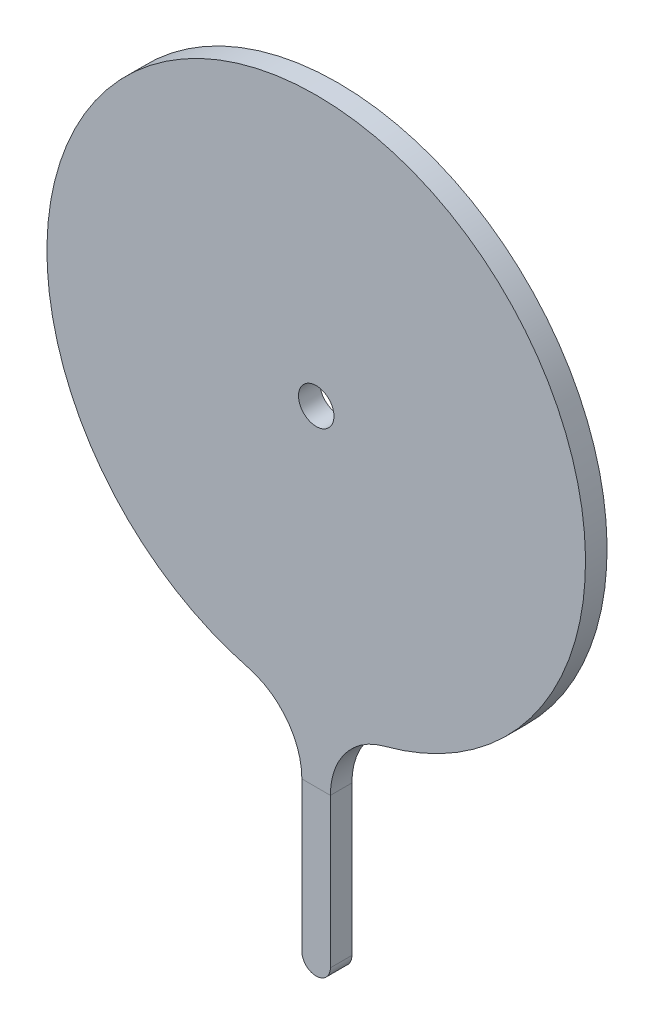
ISO-10303-21;
HEADER;
FILE_DESCRIPTION(('STEP AP214'),'2;1');
FILE_NAME('part.step','',(''),(''),'','','');
FILE_SCHEMA(('AUTOMOTIVE_DESIGN { 1 0 10303 214 1 1 1 1 }'));
ENDSEC;
DATA;
#1=APPLICATION_CONTEXT('core data for automotive mechanical design processes');
#2=APPLICATION_PROTOCOL_DEFINITION('international standard','automotive_design',2000,#1);
#3=PRODUCT_CONTEXT('',#1,'mechanical');
#4=PRODUCT('Part','Part','',(#3));
#5=PRODUCT_RELATED_PRODUCT_CATEGORY('part','',(#4));
#6=PRODUCT_DEFINITION_FORMATION('','',#4);
#7=PRODUCT_DEFINITION_CONTEXT('part definition',#1,'design');
#8=PRODUCT_DEFINITION('design','',#6,#7);
#9=PRODUCT_DEFINITION_SHAPE('','',#8);
#10=(LENGTH_UNIT() NAMED_UNIT(*) SI_UNIT(.MILLI.,.METRE.));
#11=(NAMED_UNIT(*) PLANE_ANGLE_UNIT() SI_UNIT($,.RADIAN.));
#12=(NAMED_UNIT(*) SI_UNIT($,.STERADIAN.) SOLID_ANGLE_UNIT());
#13=UNCERTAINTY_MEASURE_WITH_UNIT(LENGTH_MEASURE(1.E-05),#10,'distance_accuracy_value','');
#14=(GEOMETRIC_REPRESENTATION_CONTEXT(3) GLOBAL_UNCERTAINTY_ASSIGNED_CONTEXT((#13)) GLOBAL_UNIT_ASSIGNED_CONTEXT((#10,
#11,#12)) REPRESENTATION_CONTEXT('',''));
#15=CARTESIAN_POINT('',(0.,0.,0.));
#16=DIRECTION('',(0.,0.,1.));
#17=DIRECTION('',(1.,0.,0.));
#18=AXIS2_PLACEMENT_3D('',#15,#16,#17);
#19=CARTESIAN_POINT('',(0.,0.,0.));
#20=DIRECTION('',(0.,0.,1.));
#21=DIRECTION('',(1.,0.,0.));
#22=AXIS2_PLACEMENT_3D('',#19,#20,#21);
#23=PLANE('',#22);
#24=CARTESIAN_POINT('',(0.,0.,0.));
#25=DIRECTION('',(0.,0.,1.));
#26=DIRECTION('',(1.,0.,0.));
#27=AXIS2_PLACEMENT_3D('',#24,#25,#26);
#28=CIRCLE('',#27,0.626999999999999);
#29=CARTESIAN_POINT('',(0.627000000000001,0.,0.));
#30=VERTEX_POINT('',#29);
#31=EDGE_CURVE('E126',#30,#30,#28,.T.);
#32=ORIENTED_EDGE('',*,*,#31,.T.);
#33=EDGE_LOOP('',(#32));
#34=FACE_BOUND('',#33,.T.);
#35=DIRECTION('',(0.999997858412902,-0.00206958198912066,0.));
#36=VECTOR('',#35,1.);
#37=CARTESIAN_POINT('',(-0.0241616836473384,-11.6746434932284,0.));
#38=LINE('',#37,#36);
#39=CARTESIAN_POINT('',(-0.508,-11.6736421480188,0.));
#40=VERTEX_POINT('',#39);
#41=CARTESIAN_POINT('',(0.499999,-11.6757282890618,0.));
#42=VERTEX_POINT('',#41);
#43=EDGE_CURVE('E11',#40,#42,#38,.T.);
#44=ORIENTED_EDGE('',*,*,#43,.F.);
#45=CARTESIAN_POINT('',(-3.048,-11.6736421480188,0.));
#46=DIRECTION('',(0.,0.,1.));
#47=DIRECTION('',(1.,0.,0.));
#48=AXIS2_PLACEMENT_3D('',#45,#46,#47);
#49=CIRCLE('',#48,2.54);
#50=CARTESIAN_POINT('',(-2.40631578947368,-9.21603327475165,0.));
#51=VERTEX_POINT('',#50);
#52=EDGE_CURVE('E118',#40,#51,#49,.T.);
#53=ORIENTED_EDGE('',*,*,#52,.T.);
#54=CARTESIAN_POINT('',(0.,0.,0.));
#55=DIRECTION('',(0.,0.,1.));
#56=DIRECTION('',(1.,0.,0.));
#57=AXIS2_PLACEMENT_3D('',#54,#55,#56);
#58=CIRCLE('',#57,9.525);
#59=CARTESIAN_POINT('',(2.39999921052632,-9.21768022820672,0.));
#60=VERTEX_POINT('',#59);
#61=EDGE_CURVE('E111',#60,#51,#58,.T.);
#62=ORIENTED_EDGE('',*,*,#61,.F.);
#63=CARTESIAN_POINT('',(3.039999,-11.6757282890618,0.));
#64=DIRECTION('',(0.,0.,1.));
#65=DIRECTION('',(1.,0.,0.));
#66=AXIS2_PLACEMENT_3D('',#63,#64,#65);
#67=CIRCLE('',#66,2.54);
#68=EDGE_CURVE('E95',#60,#42,#67,.T.);
#69=ORIENTED_EDGE('',*,*,#68,.T.);
#70=EDGE_LOOP('',(#44,#53,#62,#69));
#71=FACE_BOUND('',#70,.T.);
#72=ADVANCED_FACE('F39',(#34,#71),#23,.F.);
#73=CARTESIAN_POINT('',(0.,0.,0.762));
#74=DIRECTION('',(0.,0.,1.));
#75=DIRECTION('',(1.,0.,0.));
#76=AXIS2_PLACEMENT_3D('',#73,#74,#75);
#77=PLANE('',#76);
#78=CARTESIAN_POINT('',(0.,0.,0.762));
#79=DIRECTION('',(0.,0.,1.));
#80=DIRECTION('',(1.,0.,0.));
#81=AXIS2_PLACEMENT_3D('',#78,#79,#80);
#82=CIRCLE('',#81,0.626999999999999);
#83=CARTESIAN_POINT('',(0.627000000000001,0.,0.762));
#84=VERTEX_POINT('',#83);
#85=EDGE_CURVE('E120',#84,#84,#82,.T.);
#86=ORIENTED_EDGE('',*,*,#85,.F.);
#87=EDGE_LOOP('',(#86));
#88=FACE_BOUND('',#87,.T.);
#89=CARTESIAN_POINT('',(-3.048,-11.6736421480188,0.762));
#90=DIRECTION('',(0.,0.,1.));
#91=DIRECTION('',(1.,0.,0.));
#92=AXIS2_PLACEMENT_3D('',#89,#90,#91);
#93=CIRCLE('',#92,2.54);
#94=CARTESIAN_POINT('',(-2.40631578947368,-9.21603327475165,0.762));
#95=VERTEX_POINT('',#94);
#96=CARTESIAN_POINT('',(-0.508,-11.6736421480188,0.762));
#97=VERTEX_POINT('',#96);
#98=EDGE_CURVE('E140',#95,#97,#93,.F.);
#99=ORIENTED_EDGE('',*,*,#98,.T.);
#100=DIRECTION('',(0.999997858412902,-0.00206958198912066,0.));
#101=VECTOR('',#100,1.);
#102=CARTESIAN_POINT('',(-0.0241616836473384,-11.6746434932284,0.762));
#103=LINE('',#102,#101);
#104=CARTESIAN_POINT('',(0.499999,-11.6757282890618,0.762));
#105=VERTEX_POINT('',#104);
#106=EDGE_CURVE('E44',#97,#105,#103,.T.);
#107=ORIENTED_EDGE('',*,*,#106,.T.);
#108=CARTESIAN_POINT('',(3.039999,-11.6757282890618,0.762));
#109=DIRECTION('',(0.,0.,1.));
#110=DIRECTION('',(1.,0.,0.));
#111=AXIS2_PLACEMENT_3D('',#108,#109,#110);
#112=CIRCLE('',#111,2.54);
#113=CARTESIAN_POINT('',(2.39999921052632,-9.21768022820672,0.762));
#114=VERTEX_POINT('',#113);
#115=EDGE_CURVE('E104',#105,#114,#112,.F.);
#116=ORIENTED_EDGE('',*,*,#115,.T.);
#117=CARTESIAN_POINT('',(0.,0.,0.762));
#118=DIRECTION('',(0.,0.,1.));
#119=DIRECTION('',(1.,0.,0.));
#120=AXIS2_PLACEMENT_3D('',#117,#118,#119);
#121=CIRCLE('',#120,9.525);
#122=EDGE_CURVE('E114',#114,#95,#121,.T.);
#123=ORIENTED_EDGE('',*,*,#122,.T.);
#124=EDGE_LOOP('',(#99,#107,#116,#123));
#125=FACE_BOUND('',#124,.T.);
#126=ADVANCED_FACE('F154',(#88,#125),#77,.T.);
#127=CARTESIAN_POINT('',(-0.00400049999999913,-16.9585005,0.762));
#128=DIRECTION('',(0.,0.,-1.));
#129=DIRECTION('',(-1.,0.,0.));
#130=AXIS2_PLACEMENT_3D('',#127,#128,#129);
#131=CYLINDRICAL_SURFACE('',#130,0.503999499999999);
#132=DIRECTION('',(0.,0.,-1.));
#133=VECTOR('',#132,1.);
#134=CARTESIAN_POINT('',(0.499999000000001,-16.9585005,0.762));
#135=LINE('',#134,#133);
#136=CARTESIAN_POINT('',(0.499999000000001,-16.9585005,0.762));
#137=VERTEX_POINT('',#136);
#138=CARTESIAN_POINT('',(0.499999000000001,-16.9585005,0.));
#139=VERTEX_POINT('',#138);
#140=EDGE_CURVE('E143',#137,#139,#135,.T.);
#141=ORIENTED_EDGE('',*,*,#140,.F.);
#142=CARTESIAN_POINT('',(-0.00400049999999913,-16.9585005,0.762));
#143=DIRECTION('',(0.,0.,1.));
#144=DIRECTION('',(1.,0.,0.));
#145=AXIS2_PLACEMENT_3D('',#142,#143,#144);
#146=CIRCLE('',#145,0.503999499999999);
#147=CARTESIAN_POINT('',(-0.507999999999999,-16.9585005,0.762));
#148=VERTEX_POINT('',#147);
#149=EDGE_CURVE('E63',#148,#137,#146,.T.);
#150=ORIENTED_EDGE('',*,*,#149,.F.);
#151=DIRECTION('',(0.,0.,-1.));
#152=VECTOR('',#151,1.);
#153=CARTESIAN_POINT('',(-0.507999999999999,-16.9585005,0.762));
#154=LINE('',#153,#152);
#155=CARTESIAN_POINT('',(-0.507999999999999,-16.9585005,0.));
#156=VERTEX_POINT('',#155);
#157=EDGE_CURVE('E146',#156,#148,#154,.F.);
#158=ORIENTED_EDGE('',*,*,#157,.F.);
#159=CARTESIAN_POINT('',(-0.00400049999999913,-16.9585005,0.));
#160=DIRECTION('',(0.,0.,1.));
#161=DIRECTION('',(1.,0.,0.));
#162=AXIS2_PLACEMENT_3D('',#159,#160,#161);
#163=CIRCLE('',#162,0.503999499999999);
#164=EDGE_CURVE('E56',#139,#156,#163,.F.);
#165=ORIENTED_EDGE('',*,*,#164,.F.);
#166=EDGE_LOOP('',(#141,#150,#158,#165));
#167=FACE_BOUND('',#166,.T.);
#168=ADVANCED_FACE('F42',(#167),#131,.T.);
#169=ORIENTED_EDGE('',*,*,#106,.F.);
#170=DIRECTION('',(0.,-1.,0.));
#171=VECTOR('',#170,1.);
#172=CARTESIAN_POINT('',(-0.508,-9.51144368642321,0.762));
#173=LINE('',#172,#171);
#174=EDGE_CURVE('E162',#97,#148,#173,.T.);
#175=ORIENTED_EDGE('',*,*,#174,.T.);
#176=ORIENTED_EDGE('',*,*,#149,.T.);
#177=DIRECTION('',(0.,1.,0.));
#178=VECTOR('',#177,1.);
#179=CARTESIAN_POINT('',(0.499999,-9.51186763995373,0.762));
#180=LINE('',#179,#178);
#181=EDGE_CURVE('E129',#137,#105,#180,.T.);
#182=ORIENTED_EDGE('',*,*,#181,.T.);
#183=EDGE_LOOP('',(#169,#175,#176,#182));
#184=FACE_BOUND('',#183,.T.);
#185=ADVANCED_FACE('F160',(#184),#77,.T.);
#186=DIRECTION('',(0.,-1.,0.));
#187=VECTOR('',#186,1.);
#188=CARTESIAN_POINT('',(-0.508,-9.51144368642321,0.));
#189=LINE('',#188,#187);
#190=EDGE_CURVE('E119',#40,#156,#189,.T.);
#191=ORIENTED_EDGE('',*,*,#190,.F.);
#192=ORIENTED_EDGE('',*,*,#43,.T.);
#193=DIRECTION('',(0.,1.,0.));
#194=VECTOR('',#193,1.);
#195=CARTESIAN_POINT('',(0.499999,-9.51186763995373,0.));
#196=LINE('',#195,#194);
#197=EDGE_CURVE('E123',#139,#42,#196,.T.);
#198=ORIENTED_EDGE('',*,*,#197,.F.);
#199=ORIENTED_EDGE('',*,*,#164,.T.);
#200=EDGE_LOOP('',(#191,#192,#198,#199));
#201=FACE_BOUND('',#200,.T.);
#202=ADVANCED_FACE('F164',(#201),#23,.F.);
#203=CARTESIAN_POINT('',(0.,0.,0.762));
#204=DIRECTION('',(0.,0.,-1.));
#205=DIRECTION('',(-1.,0.,0.));
#206=AXIS2_PLACEMENT_3D('',#203,#204,#205);
#207=CYLINDRICAL_SURFACE('',#206,9.525);
#208=ORIENTED_EDGE('',*,*,#122,.F.);
#209=DIRECTION('',(0.,0.,-1.));
#210=VECTOR('',#209,1.);
#211=CARTESIAN_POINT('',(2.39999921052631,-9.21768022820672,0.762));
#212=LINE('',#211,#210);
#213=EDGE_CURVE('E99',#114,#60,#212,.T.);
#214=ORIENTED_EDGE('',*,*,#213,.T.);
#215=ORIENTED_EDGE('',*,*,#61,.T.);
#216=DIRECTION('',(0.,0.,-1.));
#217=VECTOR('',#216,1.);
#218=CARTESIAN_POINT('',(-2.40631578947368,-9.21603327475165,0.762));
#219=LINE('',#218,#217);
#220=EDGE_CURVE('E115',#51,#95,#219,.F.);
#221=ORIENTED_EDGE('',*,*,#220,.T.);
#222=EDGE_LOOP('',(#208,#214,#215,#221));
#223=FACE_BOUND('',#222,.T.);
#224=ADVANCED_FACE('F110',(#223),#207,.T.);
#225=CARTESIAN_POINT('',(-0.508,-9.51144368642321,0.762));
#226=DIRECTION('',(1.,0.,0.));
#227=DIRECTION('',(0.,1.,0.));
#228=AXIS2_PLACEMENT_3D('',#225,#226,#227);
#229=PLANE('',#228);
#230=ORIENTED_EDGE('',*,*,#190,.T.);
#231=ORIENTED_EDGE('',*,*,#157,.T.);
#232=ORIENTED_EDGE('',*,*,#174,.F.);
#233=DIRECTION('',(0.,0.,1.));
#234=VECTOR('',#233,1.);
#235=CARTESIAN_POINT('',(-0.508,-11.6736421480188,0.));
#236=LINE('',#235,#234);
#237=EDGE_CURVE('E105',#97,#40,#236,.F.);
#238=ORIENTED_EDGE('',*,*,#237,.T.);
#239=EDGE_LOOP('',(#230,#231,#232,#238));
#240=FACE_BOUND('',#239,.T.);
#241=ADVANCED_FACE('F169',(#240),#229,.F.);
#242=CARTESIAN_POINT('',(0.499999,-9.51186763995373,0.762));
#243=DIRECTION('',(-1.,0.,0.));
#244=DIRECTION('',(0.,-1.,0.));
#245=AXIS2_PLACEMENT_3D('',#242,#243,#244);
#246=PLANE('',#245);
#247=ORIENTED_EDGE('',*,*,#181,.F.);
#248=ORIENTED_EDGE('',*,*,#140,.T.);
#249=ORIENTED_EDGE('',*,*,#197,.T.);
#250=DIRECTION('',(0.,0.,1.));
#251=VECTOR('',#250,1.);
#252=CARTESIAN_POINT('',(0.499999000000001,-11.6757282890618,0.762));
#253=LINE('',#252,#251);
#254=EDGE_CURVE('E101',#42,#105,#253,.T.);
#255=ORIENTED_EDGE('',*,*,#254,.T.);
#256=EDGE_LOOP('',(#247,#248,#249,#255));
#257=FACE_BOUND('',#256,.T.);
#258=ADVANCED_FACE('F163',(#257),#246,.F.);
#259=CARTESIAN_POINT('',(0.,0.,0.762));
#260=DIRECTION('',(0.,0.,-1.));
#261=DIRECTION('',(-1.,0.,0.));
#262=AXIS2_PLACEMENT_3D('',#259,#260,#261);
#263=CYLINDRICAL_SURFACE('',#262,0.626999999999999);
#264=ORIENTED_EDGE('',*,*,#85,.T.);
#265=EDGE_LOOP('',(#264));
#266=FACE_BOUND('',#265,.T.);
#267=ORIENTED_EDGE('',*,*,#31,.F.);
#268=EDGE_LOOP('',(#267));
#269=FACE_BOUND('',#268,.T.);
#270=ADVANCED_FACE('F176',(#266,#269),#263,.F.);
#271=CARTESIAN_POINT('',(3.039999,-11.6757282890618,0.762));
#272=DIRECTION('',(0.,0.,-1.));
#273=DIRECTION('',(-1.,0.,0.));
#274=AXIS2_PLACEMENT_3D('',#271,#272,#273);
#275=CYLINDRICAL_SURFACE('',#274,2.54);
#276=ORIENTED_EDGE('',*,*,#115,.F.);
#277=ORIENTED_EDGE('',*,*,#254,.F.);
#278=ORIENTED_EDGE('',*,*,#68,.F.);
#279=ORIENTED_EDGE('',*,*,#213,.F.);
#280=EDGE_LOOP('',(#276,#277,#278,#279));
#281=FACE_BOUND('',#280,.T.);
#282=ADVANCED_FACE('F98',(#281),#275,.F.);
#283=CARTESIAN_POINT('',(-3.048,-11.6736421480188,0.762));
#284=DIRECTION('',(0.,0.,-1.));
#285=DIRECTION('',(-1.,0.,0.));
#286=AXIS2_PLACEMENT_3D('',#283,#284,#285);
#287=CYLINDRICAL_SURFACE('',#286,2.54);
#288=ORIENTED_EDGE('',*,*,#98,.F.);
#289=ORIENTED_EDGE('',*,*,#220,.F.);
#290=ORIENTED_EDGE('',*,*,#52,.F.);
#291=ORIENTED_EDGE('',*,*,#237,.F.);
#292=EDGE_LOOP('',(#288,#289,#290,#291));
#293=FACE_BOUND('',#292,.T.);
#294=ADVANCED_FACE('F167',(#293),#287,.F.);
#295=CLOSED_SHELL('',(#72,#126,#168,#185,#202,#224,#241,#258,#270,#282,#294));
#296=MANIFOLD_SOLID_BREP('B2',#295);
#297=ADVANCED_BREP_SHAPE_REPRESENTATION('',(#18,#296),#14);
#298=SHAPE_DEFINITION_REPRESENTATION(#9,#297);
ENDSEC;
END-ISO-10303-21;
